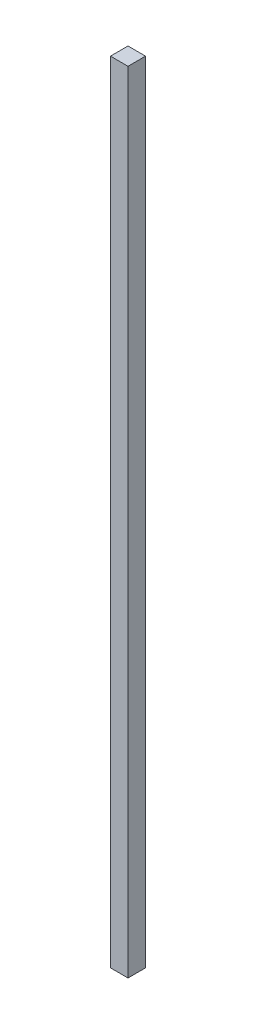
ISO-10303-21;
HEADER;
FILE_DESCRIPTION(('STEP AP214'),'2;1');
FILE_NAME('part.step','',(''),(''),'','','');
FILE_SCHEMA(('AUTOMOTIVE_DESIGN { 1 0 10303 214 1 1 1 1 }'));
ENDSEC;
DATA;
#1=APPLICATION_CONTEXT('core data for automotive mechanical design processes');
#2=APPLICATION_PROTOCOL_DEFINITION('international standard','automotive_design',2000,#1);
#3=PRODUCT_CONTEXT('',#1,'mechanical');
#4=PRODUCT('Part','Part','',(#3));
#5=PRODUCT_RELATED_PRODUCT_CATEGORY('part','',(#4));
#6=PRODUCT_DEFINITION_FORMATION('','',#4);
#7=PRODUCT_DEFINITION_CONTEXT('part definition',#1,'design');
#8=PRODUCT_DEFINITION('design','',#6,#7);
#9=PRODUCT_DEFINITION_SHAPE('','',#8);
#10=(LENGTH_UNIT() NAMED_UNIT(*) SI_UNIT(.MILLI.,.METRE.));
#11=(NAMED_UNIT(*) PLANE_ANGLE_UNIT() SI_UNIT($,.RADIAN.));
#12=(NAMED_UNIT(*) SI_UNIT($,.STERADIAN.) SOLID_ANGLE_UNIT());
#13=UNCERTAINTY_MEASURE_WITH_UNIT(LENGTH_MEASURE(1.E-05),#10,'distance_accuracy_value','');
#14=(GEOMETRIC_REPRESENTATION_CONTEXT(3) GLOBAL_UNCERTAINTY_ASSIGNED_CONTEXT((#13)) GLOBAL_UNIT_ASSIGNED_CONTEXT((#10,
#11,#12)) REPRESENTATION_CONTEXT('',''));
#15=CARTESIAN_POINT('',(0.,0.,0.));
#16=DIRECTION('',(0.,0.,1.));
#17=DIRECTION('',(1.,0.,0.));
#18=AXIS2_PLACEMENT_3D('',#15,#16,#17);
#19=CARTESIAN_POINT('',(10.,900.,-10.));
#20=DIRECTION('',(-1.,0.,0.));
#21=DIRECTION('',(0.,0.,1.));
#22=AXIS2_PLACEMENT_3D('',#19,#20,#21);
#23=PLANE('',#22);
#24=DIRECTION('',(0.,0.,-1.));
#25=VECTOR('',#24,1.);
#26=CARTESIAN_POINT('',(10.,0.,-10.));
#27=LINE('',#26,#25);
#28=CARTESIAN_POINT('',(10.,0.,9.99999999999999));
#29=VERTEX_POINT('',#28);
#30=CARTESIAN_POINT('',(10.,0.,-10.));
#31=VERTEX_POINT('',#30);
#32=EDGE_CURVE('E96',#29,#31,#27,.T.);
#33=ORIENTED_EDGE('',*,*,#32,.T.);
#34=DIRECTION('',(0.,-1.,0.));
#35=VECTOR('',#34,1.);
#36=CARTESIAN_POINT('',(10.,900.,-10.));
#37=LINE('',#36,#35);
#38=CARTESIAN_POINT('',(10.,900.,-10.));
#39=VERTEX_POINT('',#38);
#40=EDGE_CURVE('E11',#39,#31,#37,.T.);
#41=ORIENTED_EDGE('',*,*,#40,.F.);
#42=DIRECTION('',(0.,0.,-1.));
#43=VECTOR('',#42,1.);
#44=CARTESIAN_POINT('',(10.,900.,-10.));
#45=LINE('',#44,#43);
#46=CARTESIAN_POINT('',(10.,900.,9.99999999999999));
#47=VERTEX_POINT('',#46);
#48=EDGE_CURVE('E84',#47,#39,#45,.T.);
#49=ORIENTED_EDGE('',*,*,#48,.F.);
#50=DIRECTION('',(0.,-1.,0.));
#51=VECTOR('',#50,1.);
#52=CARTESIAN_POINT('',(10.,900.,9.99999999999999));
#53=LINE('',#52,#51);
#54=EDGE_CURVE('E92',#47,#29,#53,.T.);
#55=ORIENTED_EDGE('',*,*,#54,.T.);
#56=EDGE_LOOP('',(#33,#41,#49,#55));
#57=FACE_BOUND('',#56,.T.);
#58=ADVANCED_FACE('F33',(#57),#23,.F.);
#59=CARTESIAN_POINT('',(-10.,900.,-10.));
#60=DIRECTION('',(0.,0.,1.));
#61=DIRECTION('',(1.,0.,0.));
#62=AXIS2_PLACEMENT_3D('',#59,#60,#61);
#63=PLANE('',#62);
#64=DIRECTION('',(-1.,0.,0.));
#65=VECTOR('',#64,1.);
#66=CARTESIAN_POINT('',(-10.,0.,-10.));
#67=LINE('',#66,#65);
#68=CARTESIAN_POINT('',(-10.,0.,-10.));
#69=VERTEX_POINT('',#68);
#70=EDGE_CURVE('E88',#31,#69,#67,.T.);
#71=ORIENTED_EDGE('',*,*,#70,.T.);
#72=DIRECTION('',(0.,-1.,0.));
#73=VECTOR('',#72,1.);
#74=CARTESIAN_POINT('',(-10.,900.,-10.));
#75=LINE('',#74,#73);
#76=CARTESIAN_POINT('',(-10.,900.,-10.));
#77=VERTEX_POINT('',#76);
#78=EDGE_CURVE('E41',#77,#69,#75,.T.);
#79=ORIENTED_EDGE('',*,*,#78,.F.);
#80=DIRECTION('',(-1.,0.,0.));
#81=VECTOR('',#80,1.);
#82=CARTESIAN_POINT('',(-10.,900.,-10.));
#83=LINE('',#82,#81);
#84=EDGE_CURVE('E79',#39,#77,#83,.T.);
#85=ORIENTED_EDGE('',*,*,#84,.F.);
#86=ORIENTED_EDGE('',*,*,#40,.T.);
#87=EDGE_LOOP('',(#71,#79,#85,#86));
#88=FACE_BOUND('',#87,.T.);
#89=ADVANCED_FACE('F87',(#88),#63,.F.);
#90=CARTESIAN_POINT('',(-10.,900.,-10.));
#91=DIRECTION('',(1.,0.,0.));
#92=DIRECTION('',(0.,0.,-1.));
#93=AXIS2_PLACEMENT_3D('',#90,#91,#92);
#94=PLANE('',#93);
#95=DIRECTION('',(0.,0.,1.));
#96=VECTOR('',#95,1.);
#97=CARTESIAN_POINT('',(-10.,0.,-10.));
#98=LINE('',#97,#96);
#99=CARTESIAN_POINT('',(-10.,0.,9.99999999999999));
#100=VERTEX_POINT('',#99);
#101=EDGE_CURVE('E66',#69,#100,#98,.T.);
#102=ORIENTED_EDGE('',*,*,#101,.T.);
#103=DIRECTION('',(0.,-1.,0.));
#104=VECTOR('',#103,1.);
#105=CARTESIAN_POINT('',(-10.,900.,9.99999999999999));
#106=LINE('',#105,#104);
#107=CARTESIAN_POINT('',(-10.,900.,9.99999999999999));
#108=VERTEX_POINT('',#107);
#109=EDGE_CURVE('E89',#108,#100,#106,.T.);
#110=ORIENTED_EDGE('',*,*,#109,.F.);
#111=DIRECTION('',(0.,0.,1.));
#112=VECTOR('',#111,1.);
#113=CARTESIAN_POINT('',(-10.,900.,-10.));
#114=LINE('',#113,#112);
#115=EDGE_CURVE('E82',#77,#108,#114,.T.);
#116=ORIENTED_EDGE('',*,*,#115,.F.);
#117=ORIENTED_EDGE('',*,*,#78,.T.);
#118=EDGE_LOOP('',(#102,#110,#116,#117));
#119=FACE_BOUND('',#118,.T.);
#120=ADVANCED_FACE('F90',(#119),#94,.F.);
#121=CARTESIAN_POINT('',(-10.,900.,9.99999999999999));
#122=DIRECTION('',(0.,0.,-1.));
#123=DIRECTION('',(-1.,0.,0.));
#124=AXIS2_PLACEMENT_3D('',#121,#122,#123);
#125=PLANE('',#124);
#126=DIRECTION('',(1.,0.,0.));
#127=VECTOR('',#126,1.);
#128=CARTESIAN_POINT('',(-10.,0.,9.99999999999999));
#129=LINE('',#128,#127);
#130=EDGE_CURVE('E72',#100,#29,#129,.T.);
#131=ORIENTED_EDGE('',*,*,#130,.T.);
#132=ORIENTED_EDGE('',*,*,#54,.F.);
#133=DIRECTION('',(1.,0.,0.));
#134=VECTOR('',#133,1.);
#135=CARTESIAN_POINT('',(-10.,900.,9.99999999999999));
#136=LINE('',#135,#134);
#137=EDGE_CURVE('E49',#108,#47,#136,.T.);
#138=ORIENTED_EDGE('',*,*,#137,.F.);
#139=ORIENTED_EDGE('',*,*,#109,.T.);
#140=EDGE_LOOP('',(#131,#132,#138,#139));
#141=FACE_BOUND('',#140,.T.);
#142=ADVANCED_FACE('F103',(#141),#125,.F.);
#143=CARTESIAN_POINT('',(0.,900.,0.));
#144=DIRECTION('',(0.,1.,0.));
#145=DIRECTION('',(0.,0.,1.));
#146=AXIS2_PLACEMENT_3D('',#143,#144,#145);
#147=PLANE('',#146);
#148=ORIENTED_EDGE('',*,*,#48,.T.);
#149=ORIENTED_EDGE('',*,*,#84,.T.);
#150=ORIENTED_EDGE('',*,*,#115,.T.);
#151=ORIENTED_EDGE('',*,*,#137,.T.);
#152=EDGE_LOOP('',(#148,#149,#150,#151));
#153=FACE_BOUND('',#152,.T.);
#154=ADVANCED_FACE('F80',(#153),#147,.T.);
#155=CARTESIAN_POINT('',(0.,0.,0.));
#156=DIRECTION('',(0.,1.,0.));
#157=DIRECTION('',(0.,0.,1.));
#158=AXIS2_PLACEMENT_3D('',#155,#156,#157);
#159=PLANE('',#158);
#160=ORIENTED_EDGE('',*,*,#32,.F.);
#161=ORIENTED_EDGE('',*,*,#130,.F.);
#162=ORIENTED_EDGE('',*,*,#101,.F.);
#163=ORIENTED_EDGE('',*,*,#70,.F.);
#164=EDGE_LOOP('',(#160,#161,#162,#163));
#165=FACE_BOUND('',#164,.T.);
#166=ADVANCED_FACE('F106',(#165),#159,.F.);
#167=CLOSED_SHELL('',(#58,#89,#120,#142,#154,#166));
#168=MANIFOLD_SOLID_BREP('B2',#167);
#169=ADVANCED_BREP_SHAPE_REPRESENTATION('',(#18,#168),#14);
#170=SHAPE_DEFINITION_REPRESENTATION(#9,#169);
ENDSEC;
END-ISO-10303-21;
